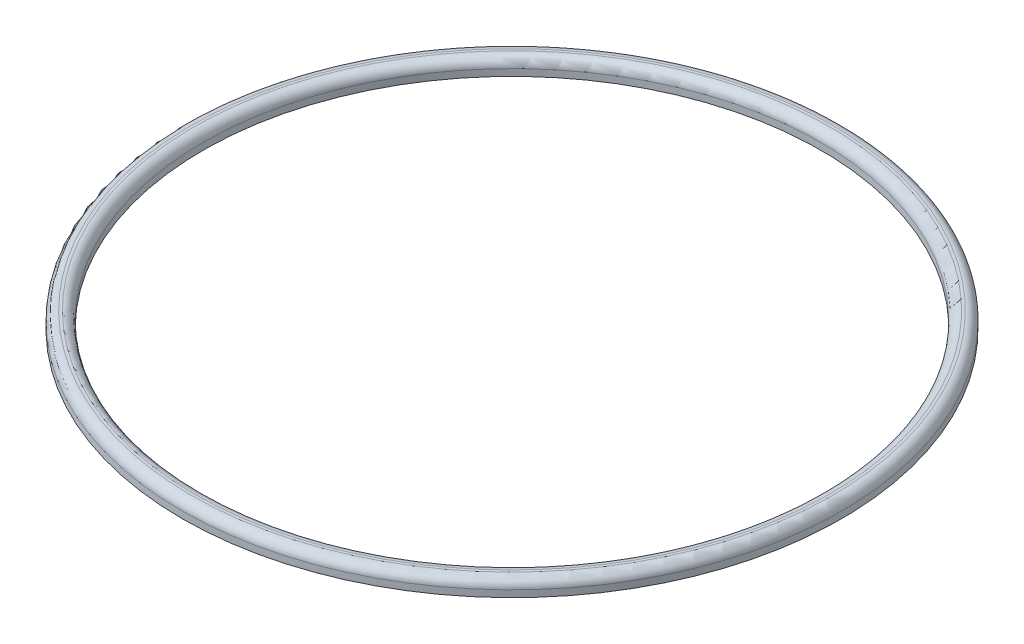
ISO-10303-21;
HEADER;
FILE_DESCRIPTION(('STEP AP214'),'2;1');
FILE_NAME('part.step','',(''),(''),'','','');
FILE_SCHEMA(('AUTOMOTIVE_DESIGN { 1 0 10303 214 1 1 1 1 }'));
ENDSEC;
DATA;
#1=APPLICATION_CONTEXT('core data for automotive mechanical design processes');
#2=APPLICATION_PROTOCOL_DEFINITION('international standard','automotive_design',2000,#1);
#3=PRODUCT_CONTEXT('',#1,'mechanical');
#4=PRODUCT('Part','Part','',(#3));
#5=PRODUCT_RELATED_PRODUCT_CATEGORY('part','',(#4));
#6=PRODUCT_DEFINITION_FORMATION('','',#4);
#7=PRODUCT_DEFINITION_CONTEXT('part definition',#1,'design');
#8=PRODUCT_DEFINITION('design','',#6,#7);
#9=PRODUCT_DEFINITION_SHAPE('','',#8);
#10=(LENGTH_UNIT() NAMED_UNIT(*) SI_UNIT(.MILLI.,.METRE.));
#11=(NAMED_UNIT(*) PLANE_ANGLE_UNIT() SI_UNIT($,.RADIAN.));
#12=(NAMED_UNIT(*) SI_UNIT($,.STERADIAN.) SOLID_ANGLE_UNIT());
#13=UNCERTAINTY_MEASURE_WITH_UNIT(LENGTH_MEASURE(1.E-05),#10,'distance_accuracy_value','');
#14=(GEOMETRIC_REPRESENTATION_CONTEXT(3) GLOBAL_UNCERTAINTY_ASSIGNED_CONTEXT((#13)) GLOBAL_UNIT_ASSIGNED_CONTEXT((#10,
#11,#12)) REPRESENTATION_CONTEXT('',''));
#15=CARTESIAN_POINT('',(0.,0.,0.));
#16=DIRECTION('',(0.,0.,1.));
#17=DIRECTION('',(1.,0.,0.));
#18=AXIS2_PLACEMENT_3D('',#15,#16,#17);
#19=CARTESIAN_POINT('',(0.,2.1,0.));
#20=DIRECTION('',(0.,1.,0.));
#21=DIRECTION('',(0.,0.,1.));
#22=AXIS2_PLACEMENT_3D('',#19,#20,#21);
#23=PLANE('',#22);
#24=CARTESIAN_POINT('',(0.,2.1,0.));
#25=DIRECTION('',(0.,1.,0.));
#26=DIRECTION('',(0.,0.,1.));
#27=AXIS2_PLACEMENT_3D('',#24,#25,#26);
#28=CIRCLE('',#27,42.325);
#29=CARTESIAN_POINT('',(0.,2.1,42.325));
#30=VERTEX_POINT('',#29);
#31=EDGE_CURVE('E39',#30,#30,#28,.F.);
#32=ORIENTED_EDGE('',*,*,#31,.T.);
#33=EDGE_LOOP('',(#32));
#34=FACE_BOUND('',#33,.T.);
#35=CARTESIAN_POINT('',(0.,2.1,0.));
#36=DIRECTION('',(0.,1.,0.));
#37=DIRECTION('',(0.,0.,1.));
#38=AXIS2_PLACEMENT_3D('',#35,#36,#37);
#39=CIRCLE('',#38,42.675);
#40=CARTESIAN_POINT('',(0.,2.1,42.675));
#41=VERTEX_POINT('',#40);
#42=EDGE_CURVE('E43',#41,#41,#39,.T.);
#43=ORIENTED_EDGE('',*,*,#42,.T.);
#44=EDGE_LOOP('',(#43));
#45=FACE_BOUND('',#44,.T.);
#46=ADVANCED_FACE('F32',(#34,#45),#23,.T.);
#47=CARTESIAN_POINT('',(0.,0.,0.));
#48=DIRECTION('',(0.,1.,0.));
#49=DIRECTION('',(0.,0.,1.));
#50=AXIS2_PLACEMENT_3D('',#47,#48,#49);
#51=PLANE('',#50);
#52=CARTESIAN_POINT('',(0.,0.,0.));
#53=DIRECTION('',(0.,1.,0.));
#54=DIRECTION('',(0.,0.,1.));
#55=AXIS2_PLACEMENT_3D('',#52,#53,#54);
#56=CIRCLE('',#55,43.875);
#57=CARTESIAN_POINT('',(0.,0.,43.875));
#58=VERTEX_POINT('',#57);
#59=EDGE_CURVE('E52',#58,#58,#56,.T.);
#60=ORIENTED_EDGE('',*,*,#59,.F.);
#61=EDGE_LOOP('',(#60));
#62=FACE_BOUND('',#61,.T.);
#63=CARTESIAN_POINT('',(0.,0.,0.));
#64=DIRECTION('',(0.,1.,0.));
#65=DIRECTION('',(0.,0.,1.));
#66=AXIS2_PLACEMENT_3D('',#63,#64,#65);
#67=CIRCLE('',#66,41.125);
#68=CARTESIAN_POINT('',(0.,0.,41.125));
#69=VERTEX_POINT('',#68);
#70=EDGE_CURVE('E55',#69,#69,#67,.T.);
#71=ORIENTED_EDGE('',*,*,#70,.T.);
#72=EDGE_LOOP('',(#71));
#73=FACE_BOUND('',#72,.T.);
#74=ADVANCED_FACE('F59',(#62,#73),#51,.F.);
#75=CARTESIAN_POINT('',(0.,2.1,0.));
#76=DIRECTION('',(0.,-1.,0.));
#77=DIRECTION('',(0.,0.,-1.));
#78=AXIS2_PLACEMENT_3D('',#75,#76,#77);
#79=CYLINDRICAL_SURFACE('',#78,43.875);
#80=CARTESIAN_POINT('',(0.,0.9,0.));
#81=DIRECTION('',(0.,1.,0.));
#82=DIRECTION('',(0.,0.,1.));
#83=AXIS2_PLACEMENT_3D('',#80,#81,#82);
#84=CIRCLE('',#83,43.875);
#85=CARTESIAN_POINT('',(0.,0.9,43.875));
#86=VERTEX_POINT('',#85);
#87=EDGE_CURVE('E10',#86,#86,#84,.F.);
#88=ORIENTED_EDGE('',*,*,#87,.T.);
#89=EDGE_LOOP('',(#88));
#90=FACE_BOUND('',#89,.T.);
#91=ORIENTED_EDGE('',*,*,#59,.T.);
#92=EDGE_LOOP('',(#91));
#93=FACE_BOUND('',#92,.T.);
#94=ADVANCED_FACE('F64',(#90,#93),#79,.T.);
#95=CARTESIAN_POINT('',(0.,2.1,0.));
#96=DIRECTION('',(0.,-1.,0.));
#97=DIRECTION('',(0.,0.,-1.));
#98=AXIS2_PLACEMENT_3D('',#95,#96,#97);
#99=CYLINDRICAL_SURFACE('',#98,41.125);
#100=CARTESIAN_POINT('',(0.,0.9,0.));
#101=DIRECTION('',(0.,1.,0.));
#102=DIRECTION('',(0.,0.,1.));
#103=AXIS2_PLACEMENT_3D('',#100,#101,#102);
#104=CIRCLE('',#103,41.125);
#105=CARTESIAN_POINT('',(0.,0.9,41.125));
#106=VERTEX_POINT('',#105);
#107=EDGE_CURVE('E47',#106,#106,#104,.T.);
#108=ORIENTED_EDGE('',*,*,#107,.T.);
#109=EDGE_LOOP('',(#108));
#110=FACE_BOUND('',#109,.T.);
#111=ORIENTED_EDGE('',*,*,#70,.F.);
#112=EDGE_LOOP('',(#111));
#113=FACE_BOUND('',#112,.T.);
#114=ADVANCED_FACE('F61',(#110,#113),#99,.F.);
#115=CARTESIAN_POINT('',(0.,0.9,0.));
#116=DIRECTION('',(0.,1.,0.));
#117=DIRECTION('',(0.,0.,1.));
#118=AXIS2_PLACEMENT_3D('',#115,#116,#117);
#119=TOROIDAL_SURFACE('',#118,42.325,1.2);
#120=ORIENTED_EDGE('',*,*,#31,.F.);
#121=EDGE_LOOP('',(#120));
#122=FACE_BOUND('',#121,.T.);
#123=ORIENTED_EDGE('',*,*,#107,.F.);
#124=EDGE_LOOP('',(#123));
#125=FACE_BOUND('',#124,.T.);
#126=ADVANCED_FACE('F63',(#122,#125),#119,.T.);
#127=CARTESIAN_POINT('',(0.,0.9,0.));
#128=DIRECTION('',(0.,1.,0.));
#129=DIRECTION('',(0.,0.,1.));
#130=AXIS2_PLACEMENT_3D('',#127,#128,#129);
#131=TOROIDAL_SURFACE('',#130,42.675,1.2);
#132=ORIENTED_EDGE('',*,*,#87,.F.);
#133=EDGE_LOOP('',(#132));
#134=FACE_BOUND('',#133,.T.);
#135=ORIENTED_EDGE('',*,*,#42,.F.);
#136=EDGE_LOOP('',(#135));
#137=FACE_BOUND('',#136,.T.);
#138=ADVANCED_FACE('F34',(#134,#137),#131,.T.);
#139=CLOSED_SHELL('',(#46,#74,#94,#114,#126,#138));
#140=MANIFOLD_SOLID_BREP('B2',#139);
#141=ADVANCED_BREP_SHAPE_REPRESENTATION('',(#18,#140),#14);
#142=SHAPE_DEFINITION_REPRESENTATION(#9,#141);
ENDSEC;
END-ISO-10303-21;
